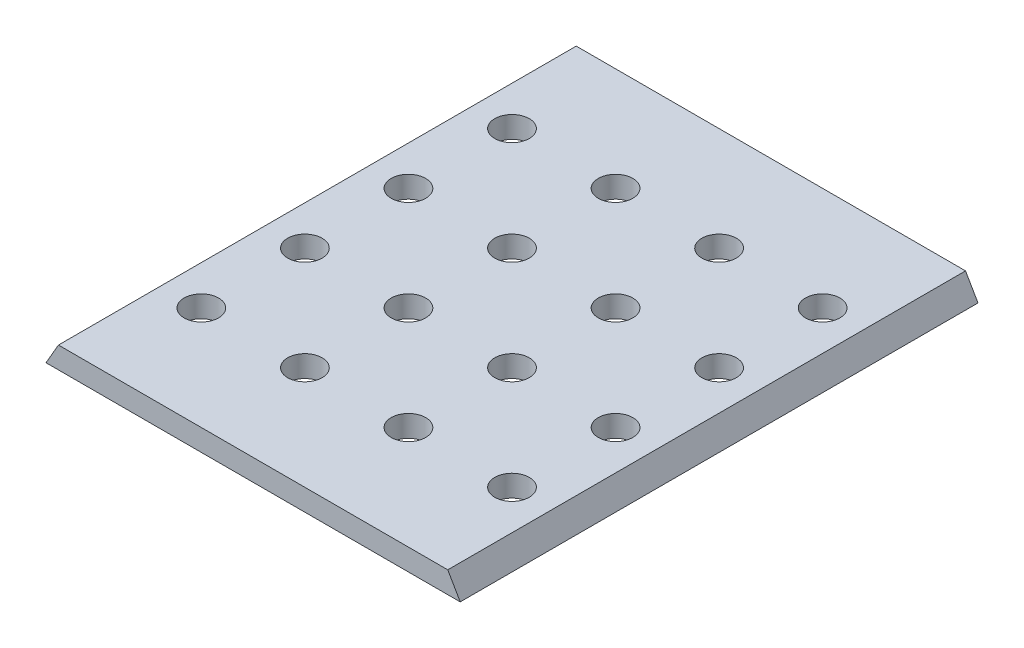
ISO-10303-21;
HEADER;
FILE_DESCRIPTION(('STEP AP214'),'2;1');
FILE_NAME('part.step','',(''),(''),'','','');
FILE_SCHEMA(('AUTOMOTIVE_DESIGN { 1 0 10303 214 1 1 1 1 }'));
ENDSEC;
DATA;
#1=APPLICATION_CONTEXT('core data for automotive mechanical design processes');
#2=APPLICATION_PROTOCOL_DEFINITION('international standard','automotive_design',2000,#1);
#3=PRODUCT_CONTEXT('',#1,'mechanical');
#4=PRODUCT('Part','Part','',(#3));
#5=PRODUCT_RELATED_PRODUCT_CATEGORY('part','',(#4));
#6=PRODUCT_DEFINITION_FORMATION('','',#4);
#7=PRODUCT_DEFINITION_CONTEXT('part definition',#1,'design');
#8=PRODUCT_DEFINITION('design','',#6,#7);
#9=PRODUCT_DEFINITION_SHAPE('','',#8);
#10=(LENGTH_UNIT() NAMED_UNIT(*) SI_UNIT(.MILLI.,.METRE.));
#11=(NAMED_UNIT(*) PLANE_ANGLE_UNIT() SI_UNIT($,.RADIAN.));
#12=(NAMED_UNIT(*) SI_UNIT($,.STERADIAN.) SOLID_ANGLE_UNIT());
#13=UNCERTAINTY_MEASURE_WITH_UNIT(LENGTH_MEASURE(1.E-05),#10,'distance_accuracy_value','');
#14=(GEOMETRIC_REPRESENTATION_CONTEXT(3) GLOBAL_UNCERTAINTY_ASSIGNED_CONTEXT((#13)) GLOBAL_UNIT_ASSIGNED_CONTEXT((#10,
#11,#12)) REPRESENTATION_CONTEXT('',''));
#15=CARTESIAN_POINT('',(0.,0.,0.));
#16=DIRECTION('',(0.,0.,1.));
#17=DIRECTION('',(1.,0.,0.));
#18=AXIS2_PLACEMENT_3D('',#15,#16,#17);
#19=CARTESIAN_POINT('',(0.,12.5,0.));
#20=DIRECTION('',(0.,-1.,0.));
#21=DIRECTION('',(0.,0.,-1.));
#22=AXIS2_PLACEMENT_3D('',#19,#20,#21);
#23=PLANE('',#22);
#24=CARTESIAN_POINT('',(30.,12.5,90.));
#25=DIRECTION('',(0.,1.,0.));
#26=DIRECTION('',(0.,0.,1.));
#27=AXIS2_PLACEMENT_3D('',#24,#25,#26);
#28=CIRCLE('',#27,9.99999999999998);
#29=CARTESIAN_POINT('',(30.,12.5,99.9999999999999));
#30=VERTEX_POINT('',#29);
#31=EDGE_CURVE('E91',#30,#30,#28,.T.);
#32=ORIENTED_EDGE('',*,*,#31,.F.);
#33=EDGE_LOOP('',(#32));
#34=FACE_BOUND('',#33,.T.);
#35=CARTESIAN_POINT('',(30.,12.5,30.));
#36=DIRECTION('',(0.,1.,0.));
#37=DIRECTION('',(0.,0.,1.));
#38=AXIS2_PLACEMENT_3D('',#35,#36,#37);
#39=CIRCLE('',#38,9.99999999999998);
#40=CARTESIAN_POINT('',(30.,12.5,40.));
#41=VERTEX_POINT('',#40);
#42=EDGE_CURVE('E103',#41,#41,#39,.T.);
#43=ORIENTED_EDGE('',*,*,#42,.F.);
#44=EDGE_LOOP('',(#43));
#45=FACE_BOUND('',#44,.T.);
#46=CARTESIAN_POINT('',(30.,12.5,-30.));
#47=DIRECTION('',(0.,1.,0.));
#48=DIRECTION('',(0.,0.,1.));
#49=AXIS2_PLACEMENT_3D('',#46,#47,#48);
#50=CIRCLE('',#49,9.99999999999998);
#51=CARTESIAN_POINT('',(30.,12.5,-20.));
#52=VERTEX_POINT('',#51);
#53=EDGE_CURVE('E108',#52,#52,#50,.T.);
#54=ORIENTED_EDGE('',*,*,#53,.F.);
#55=EDGE_LOOP('',(#54));
#56=FACE_BOUND('',#55,.T.);
#57=CARTESIAN_POINT('',(30.,12.5,-90.));
#58=DIRECTION('',(0.,1.,0.));
#59=DIRECTION('',(0.,0.,1.));
#60=AXIS2_PLACEMENT_3D('',#57,#58,#59);
#61=CIRCLE('',#60,9.99999999999998);
#62=CARTESIAN_POINT('',(30.,12.5,-80.));
#63=VERTEX_POINT('',#62);
#64=EDGE_CURVE('E114',#63,#63,#61,.T.);
#65=ORIENTED_EDGE('',*,*,#64,.F.);
#66=EDGE_LOOP('',(#65));
#67=FACE_BOUND('',#66,.T.);
#68=CARTESIAN_POINT('',(90.,12.5,-30.));
#69=DIRECTION('',(0.,1.,0.));
#70=DIRECTION('',(0.,0.,1.));
#71=AXIS2_PLACEMENT_3D('',#68,#69,#70);
#72=CIRCLE('',#71,9.99999999999998);
#73=CARTESIAN_POINT('',(90.,12.5,-20.));
#74=VERTEX_POINT('',#73);
#75=EDGE_CURVE('E125',#74,#74,#72,.T.);
#76=ORIENTED_EDGE('',*,*,#75,.F.);
#77=EDGE_LOOP('',(#76));
#78=FACE_BOUND('',#77,.T.);
#79=CARTESIAN_POINT('',(90.,12.5,-90.));
#80=DIRECTION('',(0.,1.,0.));
#81=DIRECTION('',(0.,0.,1.));
#82=AXIS2_PLACEMENT_3D('',#79,#80,#81);
#83=CIRCLE('',#82,9.99999999999998);
#84=CARTESIAN_POINT('',(90.,12.5,-80.));
#85=VERTEX_POINT('',#84);
#86=EDGE_CURVE('E128',#85,#85,#83,.T.);
#87=ORIENTED_EDGE('',*,*,#86,.F.);
#88=EDGE_LOOP('',(#87));
#89=FACE_BOUND('',#88,.T.);
#90=DIRECTION('',(-1.,0.,0.));
#91=VECTOR('',#90,1.);
#92=CARTESIAN_POINT('',(0.,12.5,-150.));
#93=LINE('',#92,#91);
#94=CARTESIAN_POINT('',(112.78312163513,12.5,-150.));
#95=VERTEX_POINT('',#94);
#96=CARTESIAN_POINT('',(-112.78312163513,12.5,-150.));
#97=VERTEX_POINT('',#96);
#98=EDGE_CURVE('E135',#95,#97,#93,.T.);
#99=ORIENTED_EDGE('',*,*,#98,.T.);
#100=DIRECTION('',(0.,0.,1.));
#101=VECTOR('',#100,1.);
#102=CARTESIAN_POINT('',(-112.78312163513,12.5,150.));
#103=LINE('',#102,#101);
#104=CARTESIAN_POINT('',(-112.78312163513,12.5,150.));
#105=VERTEX_POINT('',#104);
#106=EDGE_CURVE('E41',#97,#105,#103,.T.);
#107=ORIENTED_EDGE('',*,*,#106,.T.);
#108=DIRECTION('',(1.,0.,0.));
#109=VECTOR('',#108,1.);
#110=CARTESIAN_POINT('',(0.,12.5,150.));
#111=LINE('',#110,#109);
#112=CARTESIAN_POINT('',(112.78312163513,12.5,150.));
#113=VERTEX_POINT('',#112);
#114=EDGE_CURVE('E84',#105,#113,#111,.T.);
#115=ORIENTED_EDGE('',*,*,#114,.T.);
#116=DIRECTION('',(0.,0.,-1.));
#117=VECTOR('',#116,1.);
#118=CARTESIAN_POINT('',(112.78312163513,12.5,0.));
#119=LINE('',#118,#117);
#120=EDGE_CURVE('E137',#113,#95,#119,.T.);
#121=ORIENTED_EDGE('',*,*,#120,.T.);
#122=EDGE_LOOP('',(#99,#107,#115,#121));
#123=FACE_BOUND('',#122,.T.);
#124=CARTESIAN_POINT('',(90.,12.5,30.));
#125=DIRECTION('',(0.,1.,0.));
#126=DIRECTION('',(0.,0.,1.));
#127=AXIS2_PLACEMENT_3D('',#124,#125,#126);
#128=CIRCLE('',#127,9.99999999999998);
#129=CARTESIAN_POINT('',(90.,12.5,40.));
#130=VERTEX_POINT('',#129);
#131=EDGE_CURVE('E149',#130,#130,#128,.T.);
#132=ORIENTED_EDGE('',*,*,#131,.F.);
#133=EDGE_LOOP('',(#132));
#134=FACE_BOUND('',#133,.T.);
#135=CARTESIAN_POINT('',(90.,12.5,90.));
#136=DIRECTION('',(0.,1.,0.));
#137=DIRECTION('',(0.,0.,1.));
#138=AXIS2_PLACEMENT_3D('',#135,#136,#137);
#139=CIRCLE('',#138,9.99999999999998);
#140=CARTESIAN_POINT('',(90.,12.5,100.));
#141=VERTEX_POINT('',#140);
#142=EDGE_CURVE('E75',#141,#141,#139,.T.);
#143=ORIENTED_EDGE('',*,*,#142,.F.);
#144=EDGE_LOOP('',(#143));
#145=FACE_BOUND('',#144,.T.);
#146=CARTESIAN_POINT('',(-90.,12.5,-90.));
#147=DIRECTION('',(0.,-1.,0.));
#148=DIRECTION('',(0.,0.,1.));
#149=AXIS2_PLACEMENT_3D('',#146,#147,#148);
#150=CIRCLE('',#149,9.99999999999998);
#151=CARTESIAN_POINT('',(-90.,12.5,-80.));
#152=VERTEX_POINT('',#151);
#153=EDGE_CURVE('E98',#152,#152,#150,.T.);
#154=ORIENTED_EDGE('',*,*,#153,.T.);
#155=EDGE_LOOP('',(#154));
#156=FACE_BOUND('',#155,.T.);
#157=CARTESIAN_POINT('',(-90.,12.5,-30.));
#158=DIRECTION('',(0.,-1.,0.));
#159=DIRECTION('',(0.,0.,1.));
#160=AXIS2_PLACEMENT_3D('',#157,#158,#159);
#161=CIRCLE('',#160,9.99999999999998);
#162=CARTESIAN_POINT('',(-90.,12.5,-20.));
#163=VERTEX_POINT('',#162);
#164=EDGE_CURVE('E170',#163,#163,#161,.T.);
#165=ORIENTED_EDGE('',*,*,#164,.T.);
#166=EDGE_LOOP('',(#165));
#167=FACE_BOUND('',#166,.T.);
#168=CARTESIAN_POINT('',(-90.,12.5,30.));
#169=DIRECTION('',(0.,-1.,0.));
#170=DIRECTION('',(0.,0.,1.));
#171=AXIS2_PLACEMENT_3D('',#168,#169,#170);
#172=CIRCLE('',#171,9.99999999999998);
#173=CARTESIAN_POINT('',(-90.,12.5,40.));
#174=VERTEX_POINT('',#173);
#175=EDGE_CURVE('E174',#174,#174,#172,.T.);
#176=ORIENTED_EDGE('',*,*,#175,.T.);
#177=EDGE_LOOP('',(#176));
#178=FACE_BOUND('',#177,.T.);
#179=CARTESIAN_POINT('',(-90.,12.5,90.));
#180=DIRECTION('',(0.,-1.,0.));
#181=DIRECTION('',(0.,0.,1.));
#182=AXIS2_PLACEMENT_3D('',#179,#180,#181);
#183=CIRCLE('',#182,9.99999999999998);
#184=CARTESIAN_POINT('',(-90.,12.5,100.));
#185=VERTEX_POINT('',#184);
#186=EDGE_CURVE('E178',#185,#185,#183,.T.);
#187=ORIENTED_EDGE('',*,*,#186,.T.);
#188=EDGE_LOOP('',(#187));
#189=FACE_BOUND('',#188,.T.);
#190=CARTESIAN_POINT('',(-30.,12.5,-90.));
#191=DIRECTION('',(0.,-1.,0.));
#192=DIRECTION('',(0.,0.,1.));
#193=AXIS2_PLACEMENT_3D('',#190,#191,#192);
#194=CIRCLE('',#193,9.99999999999998);
#195=CARTESIAN_POINT('',(-30.,12.5,-80.));
#196=VERTEX_POINT('',#195);
#197=EDGE_CURVE('E182',#196,#196,#194,.T.);
#198=ORIENTED_EDGE('',*,*,#197,.T.);
#199=EDGE_LOOP('',(#198));
#200=FACE_BOUND('',#199,.T.);
#201=CARTESIAN_POINT('',(-30.,12.5,-30.));
#202=DIRECTION('',(0.,-1.,0.));
#203=DIRECTION('',(0.,0.,1.));
#204=AXIS2_PLACEMENT_3D('',#201,#202,#203);
#205=CIRCLE('',#204,9.99999999999998);
#206=CARTESIAN_POINT('',(-30.,12.5,-20.));
#207=VERTEX_POINT('',#206);
#208=EDGE_CURVE('E186',#207,#207,#205,.T.);
#209=ORIENTED_EDGE('',*,*,#208,.T.);
#210=EDGE_LOOP('',(#209));
#211=FACE_BOUND('',#210,.T.);
#212=CARTESIAN_POINT('',(-30.,12.5,30.));
#213=DIRECTION('',(0.,-1.,0.));
#214=DIRECTION('',(0.,0.,1.));
#215=AXIS2_PLACEMENT_3D('',#212,#213,#214);
#216=CIRCLE('',#215,9.99999999999998);
#217=CARTESIAN_POINT('',(-30.,12.5,40.));
#218=VERTEX_POINT('',#217);
#219=EDGE_CURVE('E190',#218,#218,#216,.T.);
#220=ORIENTED_EDGE('',*,*,#219,.T.);
#221=EDGE_LOOP('',(#220));
#222=FACE_BOUND('',#221,.T.);
#223=CARTESIAN_POINT('',(-30.,12.5,90.));
#224=DIRECTION('',(0.,-1.,0.));
#225=DIRECTION('',(0.,0.,1.));
#226=AXIS2_PLACEMENT_3D('',#223,#224,#225);
#227=CIRCLE('',#226,9.99999999999998);
#228=CARTESIAN_POINT('',(-30.,12.5,99.9999999999999));
#229=VERTEX_POINT('',#228);
#230=EDGE_CURVE('E193',#229,#229,#227,.T.);
#231=ORIENTED_EDGE('',*,*,#230,.T.);
#232=EDGE_LOOP('',(#231));
#233=FACE_BOUND('',#232,.T.);
#234=ADVANCED_FACE('F33',(#34,#45,#56,#67,#78,#89,#123,#134,#145,#156,#167,#178,#189,#200,#211,
#222,#233),#23,.F.);
#235=CARTESIAN_POINT('',(0.,0.,0.));
#236=DIRECTION('',(0.,-1.,0.));
#237=DIRECTION('',(0.,0.,-1.));
#238=AXIS2_PLACEMENT_3D('',#235,#236,#237);
#239=PLANE('',#238);
#240=CARTESIAN_POINT('',(-30.,0.,30.));
#241=DIRECTION('',(0.,-1.,0.));
#242=DIRECTION('',(0.,0.,1.));
#243=AXIS2_PLACEMENT_3D('',#240,#241,#242);
#244=CIRCLE('',#243,9.99999999999998);
#245=CARTESIAN_POINT('',(-30.,0.,40.));
#246=VERTEX_POINT('',#245);
#247=EDGE_CURVE('E200',#246,#246,#244,.T.);
#248=ORIENTED_EDGE('',*,*,#247,.F.);
#249=EDGE_LOOP('',(#248));
#250=FACE_BOUND('',#249,.T.);
#251=CARTESIAN_POINT('',(-30.,0.,-90.));
#252=DIRECTION('',(0.,-1.,0.));
#253=DIRECTION('',(0.,0.,1.));
#254=AXIS2_PLACEMENT_3D('',#251,#252,#253);
#255=CIRCLE('',#254,9.99999999999998);
#256=CARTESIAN_POINT('',(-30.,0.,-80.));
#257=VERTEX_POINT('',#256);
#258=EDGE_CURVE('E208',#257,#257,#255,.T.);
#259=ORIENTED_EDGE('',*,*,#258,.F.);
#260=EDGE_LOOP('',(#259));
#261=FACE_BOUND('',#260,.T.);
#262=CARTESIAN_POINT('',(-90.,0.,30.));
#263=DIRECTION('',(0.,-1.,0.));
#264=DIRECTION('',(0.,0.,1.));
#265=AXIS2_PLACEMENT_3D('',#262,#263,#264);
#266=CIRCLE('',#265,9.99999999999998);
#267=CARTESIAN_POINT('',(-90.,0.,40.));
#268=VERTEX_POINT('',#267);
#269=EDGE_CURVE('E216',#268,#268,#266,.T.);
#270=ORIENTED_EDGE('',*,*,#269,.F.);
#271=EDGE_LOOP('',(#270));
#272=FACE_BOUND('',#271,.T.);
#273=CARTESIAN_POINT('',(-90.,0.,-90.));
#274=DIRECTION('',(0.,-1.,0.));
#275=DIRECTION('',(0.,0.,1.));
#276=AXIS2_PLACEMENT_3D('',#273,#274,#275);
#277=CIRCLE('',#276,9.99999999999998);
#278=CARTESIAN_POINT('',(-90.,0.,-80.));
#279=VERTEX_POINT('',#278);
#280=EDGE_CURVE('E92',#279,#279,#277,.T.);
#281=ORIENTED_EDGE('',*,*,#280,.F.);
#282=EDGE_LOOP('',(#281));
#283=FACE_BOUND('',#282,.T.);
#284=CARTESIAN_POINT('',(30.,0.,90.));
#285=DIRECTION('',(0.,1.,0.));
#286=DIRECTION('',(0.,0.,1.));
#287=AXIS2_PLACEMENT_3D('',#284,#285,#286);
#288=CIRCLE('',#287,9.99999999999998);
#289=CARTESIAN_POINT('',(30.,0.,99.9999999999999));
#290=VERTEX_POINT('',#289);
#291=EDGE_CURVE('E95',#290,#290,#288,.T.);
#292=ORIENTED_EDGE('',*,*,#291,.T.);
#293=EDGE_LOOP('',(#292));
#294=FACE_BOUND('',#293,.T.);
#295=CARTESIAN_POINT('',(30.,0.,30.));
#296=DIRECTION('',(0.,1.,0.));
#297=DIRECTION('',(0.,0.,1.));
#298=AXIS2_PLACEMENT_3D('',#295,#296,#297);
#299=CIRCLE('',#298,9.99999999999998);
#300=CARTESIAN_POINT('',(30.,0.,40.));
#301=VERTEX_POINT('',#300);
#302=EDGE_CURVE('E105',#301,#301,#299,.T.);
#303=ORIENTED_EDGE('',*,*,#302,.T.);
#304=EDGE_LOOP('',(#303));
#305=FACE_BOUND('',#304,.T.);
#306=CARTESIAN_POINT('',(30.,0.,-30.));
#307=DIRECTION('',(0.,1.,0.));
#308=DIRECTION('',(0.,0.,1.));
#309=AXIS2_PLACEMENT_3D('',#306,#307,#308);
#310=CIRCLE('',#309,9.99999999999998);
#311=CARTESIAN_POINT('',(30.,0.,-20.));
#312=VERTEX_POINT('',#311);
#313=EDGE_CURVE('E111',#312,#312,#310,.T.);
#314=ORIENTED_EDGE('',*,*,#313,.T.);
#315=EDGE_LOOP('',(#314));
#316=FACE_BOUND('',#315,.T.);
#317=CARTESIAN_POINT('',(30.,0.,-90.));
#318=DIRECTION('',(0.,1.,0.));
#319=DIRECTION('',(0.,0.,1.));
#320=AXIS2_PLACEMENT_3D('',#317,#318,#319);
#321=CIRCLE('',#320,9.99999999999998);
#322=CARTESIAN_POINT('',(30.,0.,-80.));
#323=VERTEX_POINT('',#322);
#324=EDGE_CURVE('E117',#323,#323,#321,.T.);
#325=ORIENTED_EDGE('',*,*,#324,.T.);
#326=EDGE_LOOP('',(#325));
#327=FACE_BOUND('',#326,.T.);
#328=CARTESIAN_POINT('',(90.,0.,-30.));
#329=DIRECTION('',(0.,1.,0.));
#330=DIRECTION('',(0.,0.,1.));
#331=AXIS2_PLACEMENT_3D('',#328,#329,#330);
#332=CIRCLE('',#331,9.99999999999998);
#333=CARTESIAN_POINT('',(90.,0.,-20.));
#334=VERTEX_POINT('',#333);
#335=EDGE_CURVE('E120',#334,#334,#332,.T.);
#336=ORIENTED_EDGE('',*,*,#335,.T.);
#337=EDGE_LOOP('',(#336));
#338=FACE_BOUND('',#337,.T.);
#339=CARTESIAN_POINT('',(90.,0.,-90.));
#340=DIRECTION('',(0.,1.,0.));
#341=DIRECTION('',(0.,0.,1.));
#342=AXIS2_PLACEMENT_3D('',#339,#340,#341);
#343=CIRCLE('',#342,9.99999999999998);
#344=CARTESIAN_POINT('',(90.,0.,-80.));
#345=VERTEX_POINT('',#344);
#346=EDGE_CURVE('E129',#345,#345,#343,.T.);
#347=ORIENTED_EDGE('',*,*,#346,.T.);
#348=EDGE_LOOP('',(#347));
#349=FACE_BOUND('',#348,.T.);
#350=DIRECTION('',(1.,0.,0.));
#351=VECTOR('',#350,1.);
#352=CARTESIAN_POINT('',(0.,0.,150.));
#353=LINE('',#352,#351);
#354=CARTESIAN_POINT('',(-120.,0.,150.));
#355=VERTEX_POINT('',#354);
#356=CARTESIAN_POINT('',(120.,0.,150.));
#357=VERTEX_POINT('',#356);
#358=EDGE_CURVE('E90',#355,#357,#353,.T.);
#359=ORIENTED_EDGE('',*,*,#358,.F.);
#360=DIRECTION('',(0.,0.,-1.));
#361=VECTOR('',#360,1.);
#362=CARTESIAN_POINT('',(-120.,0.,150.));
#363=LINE('',#362,#361);
#364=CARTESIAN_POINT('',(-120.,0.,-150.));
#365=VERTEX_POINT('',#364);
#366=EDGE_CURVE('E74',#355,#365,#363,.T.);
#367=ORIENTED_EDGE('',*,*,#366,.T.);
#368=DIRECTION('',(-1.,0.,0.));
#369=VECTOR('',#368,1.);
#370=CARTESIAN_POINT('',(0.,0.,-150.));
#371=LINE('',#370,#369);
#372=CARTESIAN_POINT('',(120.,0.,-150.));
#373=VERTEX_POINT('',#372);
#374=EDGE_CURVE('E78',#373,#365,#371,.T.);
#375=ORIENTED_EDGE('',*,*,#374,.F.);
#376=DIRECTION('',(0.,0.,-1.));
#377=VECTOR('',#376,1.);
#378=CARTESIAN_POINT('',(120.,0.,150.));
#379=LINE('',#378,#377);
#380=EDGE_CURVE('E85',#357,#373,#379,.T.);
#381=ORIENTED_EDGE('',*,*,#380,.F.);
#382=EDGE_LOOP('',(#359,#367,#375,#381));
#383=FACE_BOUND('',#382,.T.);
#384=CARTESIAN_POINT('',(90.,0.,30.));
#385=DIRECTION('',(0.,1.,0.));
#386=DIRECTION('',(0.,0.,1.));
#387=AXIS2_PLACEMENT_3D('',#384,#385,#386);
#388=CIRCLE('',#387,9.99999999999998);
#389=CARTESIAN_POINT('',(90.,0.,40.));
#390=VERTEX_POINT('',#389);
#391=EDGE_CURVE('E146',#390,#390,#388,.T.);
#392=ORIENTED_EDGE('',*,*,#391,.T.);
#393=EDGE_LOOP('',(#392));
#394=FACE_BOUND('',#393,.T.);
#395=CARTESIAN_POINT('',(90.,0.,90.));
#396=DIRECTION('',(0.,1.,0.));
#397=DIRECTION('',(0.,0.,1.));
#398=AXIS2_PLACEMENT_3D('',#395,#396,#397);
#399=CIRCLE('',#398,9.99999999999998);
#400=CARTESIAN_POINT('',(90.,0.,100.));
#401=VERTEX_POINT('',#400);
#402=EDGE_CURVE('E152',#401,#401,#399,.T.);
#403=ORIENTED_EDGE('',*,*,#402,.T.);
#404=EDGE_LOOP('',(#403));
#405=FACE_BOUND('',#404,.T.);
#406=CARTESIAN_POINT('',(-90.,0.,-30.));
#407=DIRECTION('',(0.,-1.,0.));
#408=DIRECTION('',(0.,0.,1.));
#409=AXIS2_PLACEMENT_3D('',#406,#407,#408);
#410=CIRCLE('',#409,9.99999999999998);
#411=CARTESIAN_POINT('',(-90.,0.,-20.));
#412=VERTEX_POINT('',#411);
#413=EDGE_CURVE('E220',#412,#412,#410,.T.);
#414=ORIENTED_EDGE('',*,*,#413,.F.);
#415=EDGE_LOOP('',(#414));
#416=FACE_BOUND('',#415,.T.);
#417=CARTESIAN_POINT('',(-90.,0.,90.));
#418=DIRECTION('',(0.,-1.,0.));
#419=DIRECTION('',(0.,0.,1.));
#420=AXIS2_PLACEMENT_3D('',#417,#418,#419);
#421=CIRCLE('',#420,9.99999999999998);
#422=CARTESIAN_POINT('',(-90.,0.,100.));
#423=VERTEX_POINT('',#422);
#424=EDGE_CURVE('E212',#423,#423,#421,.T.);
#425=ORIENTED_EDGE('',*,*,#424,.F.);
#426=EDGE_LOOP('',(#425));
#427=FACE_BOUND('',#426,.T.);
#428=CARTESIAN_POINT('',(-30.,0.,-30.));
#429=DIRECTION('',(0.,-1.,0.));
#430=DIRECTION('',(0.,0.,1.));
#431=AXIS2_PLACEMENT_3D('',#428,#429,#430);
#432=CIRCLE('',#431,9.99999999999998);
#433=CARTESIAN_POINT('',(-30.,0.,-20.));
#434=VERTEX_POINT('',#433);
#435=EDGE_CURVE('E204',#434,#434,#432,.T.);
#436=ORIENTED_EDGE('',*,*,#435,.F.);
#437=EDGE_LOOP('',(#436));
#438=FACE_BOUND('',#437,.T.);
#439=CARTESIAN_POINT('',(-30.,0.,90.));
#440=DIRECTION('',(0.,-1.,0.));
#441=DIRECTION('',(0.,0.,1.));
#442=AXIS2_PLACEMENT_3D('',#439,#440,#441);
#443=CIRCLE('',#442,9.99999999999998);
#444=CARTESIAN_POINT('',(-30.,0.,99.9999999999999));
#445=VERTEX_POINT('',#444);
#446=EDGE_CURVE('E195',#445,#445,#443,.T.);
#447=ORIENTED_EDGE('',*,*,#446,.F.);
#448=EDGE_LOOP('',(#447));
#449=FACE_BOUND('',#448,.T.);
#450=ADVANCED_FACE('F88',(#250,#261,#272,#283,#294,#305,#316,#327,#338,#349,#383,#394,#405,#416,
#427,#438,#449),#239,.T.);
#451=CARTESIAN_POINT('',(0.,12.5,150.));
#452=DIRECTION('',(0.,0.,-1.));
#453=DIRECTION('',(-1.,0.,0.));
#454=AXIS2_PLACEMENT_3D('',#451,#452,#453);
#455=PLANE('',#454);
#456=ORIENTED_EDGE('',*,*,#114,.F.);
#457=DIRECTION('',(-0.499999999999999,-0.86602540378444,0.));
#458=VECTOR('',#457,1.);
#459=CARTESIAN_POINT('',(-120.,-1.21430643318376E-13,150.));
#460=LINE('',#459,#458);
#461=EDGE_CURVE('E11',#105,#355,#460,.T.);
#462=ORIENTED_EDGE('',*,*,#461,.T.);
#463=ORIENTED_EDGE('',*,*,#358,.T.);
#464=DIRECTION('',(0.499999999999997,-0.86602540378444,0.));
#465=VECTOR('',#464,1.);
#466=CARTESIAN_POINT('',(112.78312163513,12.5,150.));
#467=LINE('',#466,#465);
#468=EDGE_CURVE('E143',#357,#113,#467,.F.);
#469=ORIENTED_EDGE('',*,*,#468,.T.);
#470=EDGE_LOOP('',(#456,#462,#463,#469));
#471=FACE_BOUND('',#470,.T.);
#472=ADVANCED_FACE('F230',(#471),#455,.F.);
#473=CARTESIAN_POINT('',(0.,12.5,-150.));
#474=DIRECTION('',(0.,0.,1.));
#475=DIRECTION('',(1.,0.,0.));
#476=AXIS2_PLACEMENT_3D('',#473,#474,#475);
#477=PLANE('',#476);
#478=ORIENTED_EDGE('',*,*,#374,.T.);
#479=DIRECTION('',(0.499999999999999,0.86602540378444,0.));
#480=VECTOR('',#479,1.);
#481=CARTESIAN_POINT('',(-120.,0.,-150.));
#482=LINE('',#481,#480);
#483=EDGE_CURVE('E55',#365,#97,#482,.T.);
#484=ORIENTED_EDGE('',*,*,#483,.T.);
#485=ORIENTED_EDGE('',*,*,#98,.F.);
#486=DIRECTION('',(-0.499999999999997,0.86602540378444,0.));
#487=VECTOR('',#486,1.);
#488=CARTESIAN_POINT('',(112.78312163513,12.5,-150.));
#489=LINE('',#488,#487);
#490=EDGE_CURVE('E80',#95,#373,#489,.F.);
#491=ORIENTED_EDGE('',*,*,#490,.T.);
#492=EDGE_LOOP('',(#478,#484,#485,#491));
#493=FACE_BOUND('',#492,.T.);
#494=ADVANCED_FACE('F79',(#493),#477,.F.);
#495=CARTESIAN_POINT('',(112.78312163513,12.5,0.));
#496=DIRECTION('',(-0.86602540378444,-0.499999999999997,0.));
#497=DIRECTION('',(0.,0.,-1.));
#498=AXIS2_PLACEMENT_3D('',#495,#496,#497);
#499=PLANE('',#498);
#500=ORIENTED_EDGE('',*,*,#468,.F.);
#501=ORIENTED_EDGE('',*,*,#380,.T.);
#502=ORIENTED_EDGE('',*,*,#490,.F.);
#503=ORIENTED_EDGE('',*,*,#120,.F.);
#504=EDGE_LOOP('',(#500,#501,#502,#503));
#505=FACE_BOUND('',#504,.T.);
#506=ADVANCED_FACE('F294',(#505),#499,.F.);
#507=CARTESIAN_POINT('',(90.,0.,-90.));
#508=DIRECTION('',(0.,1.,0.));
#509=DIRECTION('',(0.,0.,1.));
#510=AXIS2_PLACEMENT_3D('',#507,#508,#509);
#511=CYLINDRICAL_SURFACE('',#510,9.99999999999998);
#512=ORIENTED_EDGE('',*,*,#346,.F.);
#513=EDGE_LOOP('',(#512));
#514=FACE_BOUND('',#513,.T.);
#515=ORIENTED_EDGE('',*,*,#86,.T.);
#516=EDGE_LOOP('',(#515));
#517=FACE_BOUND('',#516,.T.);
#518=ADVANCED_FACE('F291',(#514,#517),#511,.F.);
#519=CARTESIAN_POINT('',(90.,0.,-30.));
#520=DIRECTION('',(0.,1.,0.));
#521=DIRECTION('',(0.,0.,1.));
#522=AXIS2_PLACEMENT_3D('',#519,#520,#521);
#523=CYLINDRICAL_SURFACE('',#522,9.99999999999998);
#524=ORIENTED_EDGE('',*,*,#335,.F.);
#525=EDGE_LOOP('',(#524));
#526=FACE_BOUND('',#525,.T.);
#527=ORIENTED_EDGE('',*,*,#75,.T.);
#528=EDGE_LOOP('',(#527));
#529=FACE_BOUND('',#528,.T.);
#530=ADVANCED_FACE('F287',(#526,#529),#523,.F.);
#531=CARTESIAN_POINT('',(90.,0.,30.));
#532=DIRECTION('',(0.,1.,0.));
#533=DIRECTION('',(0.,0.,1.));
#534=AXIS2_PLACEMENT_3D('',#531,#532,#533);
#535=CYLINDRICAL_SURFACE('',#534,9.99999999999998);
#536=ORIENTED_EDGE('',*,*,#391,.F.);
#537=EDGE_LOOP('',(#536));
#538=FACE_BOUND('',#537,.T.);
#539=ORIENTED_EDGE('',*,*,#131,.T.);
#540=EDGE_LOOP('',(#539));
#541=FACE_BOUND('',#540,.T.);
#542=ADVANCED_FACE('F290',(#538,#541),#535,.F.);
#543=CARTESIAN_POINT('',(90.,0.,90.));
#544=DIRECTION('',(0.,1.,0.));
#545=DIRECTION('',(0.,0.,1.));
#546=AXIS2_PLACEMENT_3D('',#543,#544,#545);
#547=CYLINDRICAL_SURFACE('',#546,9.99999999999998);
#548=ORIENTED_EDGE('',*,*,#402,.F.);
#549=EDGE_LOOP('',(#548));
#550=FACE_BOUND('',#549,.T.);
#551=ORIENTED_EDGE('',*,*,#142,.T.);
#552=EDGE_LOOP('',(#551));
#553=FACE_BOUND('',#552,.T.);
#554=ADVANCED_FACE('F158',(#550,#553),#547,.F.);
#555=CARTESIAN_POINT('',(30.,0.,-90.));
#556=DIRECTION('',(0.,1.,0.));
#557=DIRECTION('',(0.,0.,1.));
#558=AXIS2_PLACEMENT_3D('',#555,#556,#557);
#559=CYLINDRICAL_SURFACE('',#558,9.99999999999998);
#560=ORIENTED_EDGE('',*,*,#324,.F.);
#561=EDGE_LOOP('',(#560));
#562=FACE_BOUND('',#561,.T.);
#563=ORIENTED_EDGE('',*,*,#64,.T.);
#564=EDGE_LOOP('',(#563));
#565=FACE_BOUND('',#564,.T.);
#566=ADVANCED_FACE('F282',(#562,#565),#559,.F.);
#567=CARTESIAN_POINT('',(30.,0.,-30.));
#568=DIRECTION('',(0.,1.,0.));
#569=DIRECTION('',(0.,0.,1.));
#570=AXIS2_PLACEMENT_3D('',#567,#568,#569);
#571=CYLINDRICAL_SURFACE('',#570,9.99999999999998);
#572=ORIENTED_EDGE('',*,*,#313,.F.);
#573=EDGE_LOOP('',(#572));
#574=FACE_BOUND('',#573,.T.);
#575=ORIENTED_EDGE('',*,*,#53,.T.);
#576=EDGE_LOOP('',(#575));
#577=FACE_BOUND('',#576,.T.);
#578=ADVANCED_FACE('F278',(#574,#577),#571,.F.);
#579=CARTESIAN_POINT('',(30.,0.,30.));
#580=DIRECTION('',(0.,1.,0.));
#581=DIRECTION('',(0.,0.,1.));
#582=AXIS2_PLACEMENT_3D('',#579,#580,#581);
#583=CYLINDRICAL_SURFACE('',#582,9.99999999999998);
#584=ORIENTED_EDGE('',*,*,#302,.F.);
#585=EDGE_LOOP('',(#584));
#586=FACE_BOUND('',#585,.T.);
#587=ORIENTED_EDGE('',*,*,#42,.T.);
#588=EDGE_LOOP('',(#587));
#589=FACE_BOUND('',#588,.T.);
#590=ADVANCED_FACE('F274',(#586,#589),#583,.F.);
#591=CARTESIAN_POINT('',(30.,0.,90.));
#592=DIRECTION('',(0.,1.,0.));
#593=DIRECTION('',(0.,0.,1.));
#594=AXIS2_PLACEMENT_3D('',#591,#592,#593);
#595=CYLINDRICAL_SURFACE('',#594,9.99999999999998);
#596=ORIENTED_EDGE('',*,*,#291,.F.);
#597=EDGE_LOOP('',(#596));
#598=FACE_BOUND('',#597,.T.);
#599=ORIENTED_EDGE('',*,*,#31,.T.);
#600=EDGE_LOOP('',(#599));
#601=FACE_BOUND('',#600,.T.);
#602=ADVANCED_FACE('F271',(#598,#601),#595,.F.);
#603=CARTESIAN_POINT('',(-120.,-1.21430643318376E-13,150.));
#604=DIRECTION('',(-0.866025403784439,0.499999999999999,0.));
#605=DIRECTION('',(0.,0.,1.));
#606=AXIS2_PLACEMENT_3D('',#603,#604,#605);
#607=PLANE('',#606);
#608=ORIENTED_EDGE('',*,*,#461,.F.);
#609=ORIENTED_EDGE('',*,*,#106,.F.);
#610=ORIENTED_EDGE('',*,*,#483,.F.);
#611=ORIENTED_EDGE('',*,*,#366,.F.);
#612=EDGE_LOOP('',(#608,#609,#610,#611));
#613=FACE_BOUND('',#612,.T.);
#614=ADVANCED_FACE('F35',(#613),#607,.T.);
#615=CARTESIAN_POINT('',(-90.,0.,-90.));
#616=DIRECTION('',(0.,1.,0.));
#617=DIRECTION('',(0.,0.,1.));
#618=AXIS2_PLACEMENT_3D('',#615,#616,#617);
#619=CYLINDRICAL_SURFACE('',#618,9.99999999999998);
#620=ORIENTED_EDGE('',*,*,#280,.T.);
#621=EDGE_LOOP('',(#620));
#622=FACE_BOUND('',#621,.T.);
#623=ORIENTED_EDGE('',*,*,#153,.F.);
#624=EDGE_LOOP('',(#623));
#625=FACE_BOUND('',#624,.T.);
#626=ADVANCED_FACE('F267',(#622,#625),#619,.F.);
#627=CARTESIAN_POINT('',(-90.,0.,-30.));
#628=DIRECTION('',(0.,1.,0.));
#629=DIRECTION('',(0.,0.,1.));
#630=AXIS2_PLACEMENT_3D('',#627,#628,#629);
#631=CYLINDRICAL_SURFACE('',#630,9.99999999999998);
#632=ORIENTED_EDGE('',*,*,#413,.T.);
#633=EDGE_LOOP('',(#632));
#634=FACE_BOUND('',#633,.T.);
#635=ORIENTED_EDGE('',*,*,#164,.F.);
#636=EDGE_LOOP('',(#635));
#637=FACE_BOUND('',#636,.T.);
#638=ADVANCED_FACE('F225',(#634,#637),#631,.F.);
#639=CARTESIAN_POINT('',(-90.,0.,30.));
#640=DIRECTION('',(0.,1.,0.));
#641=DIRECTION('',(0.,0.,1.));
#642=AXIS2_PLACEMENT_3D('',#639,#640,#641);
#643=CYLINDRICAL_SURFACE('',#642,9.99999999999998);
#644=ORIENTED_EDGE('',*,*,#269,.T.);
#645=EDGE_LOOP('',(#644));
#646=FACE_BOUND('',#645,.T.);
#647=ORIENTED_EDGE('',*,*,#175,.F.);
#648=EDGE_LOOP('',(#647));
#649=FACE_BOUND('',#648,.T.);
#650=ADVANCED_FACE('F260',(#646,#649),#643,.F.);
#651=CARTESIAN_POINT('',(-90.,0.,90.));
#652=DIRECTION('',(0.,1.,0.));
#653=DIRECTION('',(0.,0.,1.));
#654=AXIS2_PLACEMENT_3D('',#651,#652,#653);
#655=CYLINDRICAL_SURFACE('',#654,9.99999999999998);
#656=ORIENTED_EDGE('',*,*,#424,.T.);
#657=EDGE_LOOP('',(#656));
#658=FACE_BOUND('',#657,.T.);
#659=ORIENTED_EDGE('',*,*,#186,.F.);
#660=EDGE_LOOP('',(#659));
#661=FACE_BOUND('',#660,.T.);
#662=ADVANCED_FACE('F256',(#658,#661),#655,.F.);
#663=CARTESIAN_POINT('',(-30.,0.,-90.));
#664=DIRECTION('',(0.,1.,0.));
#665=DIRECTION('',(0.,0.,1.));
#666=AXIS2_PLACEMENT_3D('',#663,#664,#665);
#667=CYLINDRICAL_SURFACE('',#666,9.99999999999998);
#668=ORIENTED_EDGE('',*,*,#258,.T.);
#669=EDGE_LOOP('',(#668));
#670=FACE_BOUND('',#669,.T.);
#671=ORIENTED_EDGE('',*,*,#197,.F.);
#672=EDGE_LOOP('',(#671));
#673=FACE_BOUND('',#672,.T.);
#674=ADVANCED_FACE('F252',(#670,#673),#667,.F.);
#675=CARTESIAN_POINT('',(-30.,0.,-30.));
#676=DIRECTION('',(0.,1.,0.));
#677=DIRECTION('',(0.,0.,1.));
#678=AXIS2_PLACEMENT_3D('',#675,#676,#677);
#679=CYLINDRICAL_SURFACE('',#678,9.99999999999998);
#680=ORIENTED_EDGE('',*,*,#435,.T.);
#681=EDGE_LOOP('',(#680));
#682=FACE_BOUND('',#681,.T.);
#683=ORIENTED_EDGE('',*,*,#208,.F.);
#684=EDGE_LOOP('',(#683));
#685=FACE_BOUND('',#684,.T.);
#686=ADVANCED_FACE('F246',(#682,#685),#679,.F.);
#687=CARTESIAN_POINT('',(-30.,0.,30.));
#688=DIRECTION('',(0.,1.,0.));
#689=DIRECTION('',(0.,0.,1.));
#690=AXIS2_PLACEMENT_3D('',#687,#688,#689);
#691=CYLINDRICAL_SURFACE('',#690,9.99999999999998);
#692=ORIENTED_EDGE('',*,*,#247,.T.);
#693=EDGE_LOOP('',(#692));
#694=FACE_BOUND('',#693,.T.);
#695=ORIENTED_EDGE('',*,*,#219,.F.);
#696=EDGE_LOOP('',(#695));
#697=FACE_BOUND('',#696,.T.);
#698=ADVANCED_FACE('F241',(#694,#697),#691,.F.);
#699=CARTESIAN_POINT('',(-30.,0.,90.));
#700=DIRECTION('',(0.,1.,0.));
#701=DIRECTION('',(0.,0.,1.));
#702=AXIS2_PLACEMENT_3D('',#699,#700,#701);
#703=CYLINDRICAL_SURFACE('',#702,9.99999999999998);
#704=ORIENTED_EDGE('',*,*,#446,.T.);
#705=EDGE_LOOP('',(#704));
#706=FACE_BOUND('',#705,.T.);
#707=ORIENTED_EDGE('',*,*,#230,.F.);
#708=EDGE_LOOP('',(#707));
#709=FACE_BOUND('',#708,.T.);
#710=ADVANCED_FACE('F239',(#706,#709),#703,.F.);
#711=CLOSED_SHELL('',(#234,#450,#472,#494,#506,#518,#530,#542,#554,#566,#578,#590,#602,#614,
#626,#638,#650,#662,#674,#686,#698,#710));
#712=MANIFOLD_SOLID_BREP('B2',#711);
#713=ADVANCED_BREP_SHAPE_REPRESENTATION('',(#18,#712),#14);
#714=SHAPE_DEFINITION_REPRESENTATION(#9,#713);
ENDSEC;
END-ISO-10303-21;
